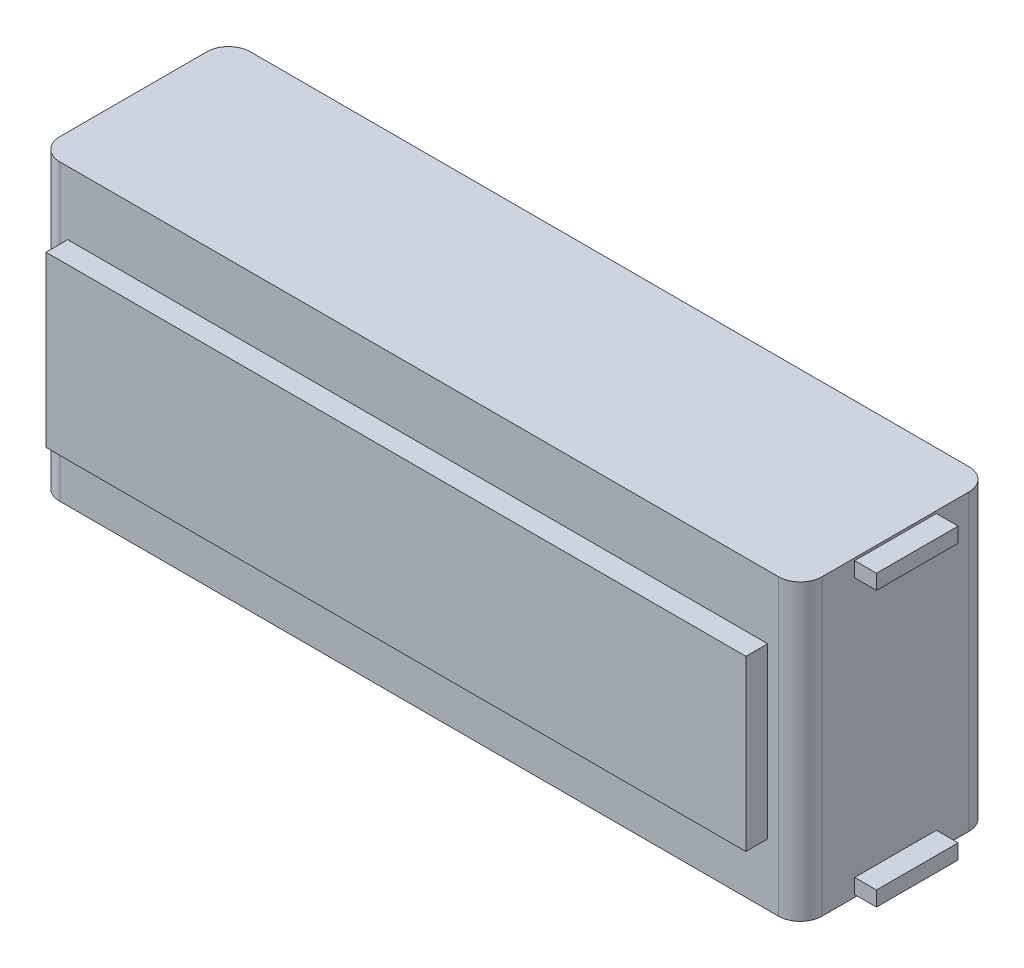
ISO-10303-21;
HEADER;
FILE_DESCRIPTION(('STEP AP214'),'2;1');
FILE_NAME('part.step','',(''),(''),'','','');
FILE_SCHEMA(('AUTOMOTIVE_DESIGN { 1 0 10303 214 1 1 1 1 }'));
ENDSEC;
DATA;
#1=APPLICATION_CONTEXT('core data for automotive mechanical design processes');
#2=APPLICATION_PROTOCOL_DEFINITION('international standard','automotive_design',2000,#1);
#3=PRODUCT_CONTEXT('',#1,'mechanical');
#4=PRODUCT('Part','Part','',(#3));
#5=PRODUCT_RELATED_PRODUCT_CATEGORY('part','',(#4));
#6=PRODUCT_DEFINITION_FORMATION('','',#4);
#7=PRODUCT_DEFINITION_CONTEXT('part definition',#1,'design');
#8=PRODUCT_DEFINITION('design','',#6,#7);
#9=PRODUCT_DEFINITION_SHAPE('','',#8);
#10=(LENGTH_UNIT() NAMED_UNIT(*) SI_UNIT(.MILLI.,.METRE.));
#11=(NAMED_UNIT(*) PLANE_ANGLE_UNIT() SI_UNIT($,.RADIAN.));
#12=(NAMED_UNIT(*) SI_UNIT($,.STERADIAN.) SOLID_ANGLE_UNIT());
#13=UNCERTAINTY_MEASURE_WITH_UNIT(LENGTH_MEASURE(1.E-05),#10,'distance_accuracy_value','');
#14=(GEOMETRIC_REPRESENTATION_CONTEXT(3) GLOBAL_UNCERTAINTY_ASSIGNED_CONTEXT((#13)) GLOBAL_UNIT_ASSIGNED_CONTEXT((#10,
#11,#12)) REPRESENTATION_CONTEXT('',''));
#15=CARTESIAN_POINT('',(0.,0.,0.));
#16=DIRECTION('',(0.,0.,1.));
#17=DIRECTION('',(1.,0.,0.));
#18=AXIS2_PLACEMENT_3D('',#15,#16,#17);
#19=CARTESIAN_POINT('',(0.,0.,22.225));
#20=DIRECTION('',(0.,0.,-1.));
#21=DIRECTION('',(-1.,0.,0.));
#22=AXIS2_PLACEMENT_3D('',#19,#20,#21);
#23=PLANE('',#22);
#24=DIRECTION('',(1.,0.,0.));
#25=VECTOR('',#24,1.);
#26=CARTESIAN_POINT('',(-44.45,-17.145,22.225));
#27=LINE('',#26,#25);
#28=CARTESIAN_POINT('',(-41.91,-17.145,22.225));
#29=VERTEX_POINT('',#28);
#30=CARTESIAN_POINT('',(41.91,-17.145,22.225));
#31=VERTEX_POINT('',#30);
#32=EDGE_CURVE('E268',#29,#31,#27,.T.);
#33=ORIENTED_EDGE('',*,*,#32,.T.);
#34=DIRECTION('',(0.,1.,0.));
#35=VECTOR('',#34,1.);
#36=CARTESIAN_POINT('',(41.91,0.,22.225));
#37=LINE('',#36,#35);
#38=CARTESIAN_POINT('',(41.91,17.145,22.225));
#39=VERTEX_POINT('',#38);
#40=EDGE_CURVE('E316',#31,#39,#37,.T.);
#41=ORIENTED_EDGE('',*,*,#40,.T.);
#42=DIRECTION('',(-1.,0.,0.));
#43=VECTOR('',#42,1.);
#44=CARTESIAN_POINT('',(-44.45,17.145,22.225));
#45=LINE('',#44,#43);
#46=CARTESIAN_POINT('',(-41.91,17.145,22.225));
#47=VERTEX_POINT('',#46);
#48=EDGE_CURVE('E265',#39,#47,#45,.T.);
#49=ORIENTED_EDGE('',*,*,#48,.T.);
#50=DIRECTION('',(0.,-1.,0.));
#51=VECTOR('',#50,1.);
#52=CARTESIAN_POINT('',(-41.91,0.,22.225));
#53=LINE('',#52,#51);
#54=EDGE_CURVE('E313',#47,#29,#53,.T.);
#55=ORIENTED_EDGE('',*,*,#54,.T.);
#56=EDGE_LOOP('',(#33,#41,#49,#55));
#57=FACE_BOUND('',#56,.T.);
#58=DIRECTION('',(0.,1.,0.));
#59=VECTOR('',#58,1.);
#60=CARTESIAN_POINT('',(40.6524536674624,-9.9630945765341,22.225));
#61=LINE('',#60,#59);
#62=CARTESIAN_POINT('',(40.6524536674624,-9.9630945765341,22.225));
#63=VERTEX_POINT('',#62);
#64=CARTESIAN_POINT('',(40.6524536674624,9.74683090603889,22.225));
#65=VERTEX_POINT('',#64);
#66=EDGE_CURVE('E192',#63,#65,#61,.T.);
#67=ORIENTED_EDGE('',*,*,#66,.F.);
#68=DIRECTION('',(1.,0.,0.));
#69=VECTOR('',#68,1.);
#70=CARTESIAN_POINT('',(40.6524536674624,-9.9630945765341,22.225));
#71=LINE('',#70,#69);
#72=CARTESIAN_POINT('',(-40.9796366165907,-9.96309457653411,22.225));
#73=VERTEX_POINT('',#72);
#74=EDGE_CURVE('E189',#73,#63,#71,.T.);
#75=ORIENTED_EDGE('',*,*,#74,.F.);
#76=DIRECTION('',(0.,-1.,0.));
#77=VECTOR('',#76,1.);
#78=CARTESIAN_POINT('',(-40.9796366165907,-9.96309457653411,22.225));
#79=LINE('',#78,#77);
#80=CARTESIAN_POINT('',(-40.9796366165907,9.74683090603888,22.225));
#81=VERTEX_POINT('',#80);
#82=EDGE_CURVE('E55',#81,#73,#79,.T.);
#83=ORIENTED_EDGE('',*,*,#82,.F.);
#84=DIRECTION('',(-1.,0.,0.));
#85=VECTOR('',#84,1.);
#86=CARTESIAN_POINT('',(40.6524536674624,9.74683090603889,22.225));
#87=LINE('',#86,#85);
#88=EDGE_CURVE('E50',#65,#81,#87,.T.);
#89=ORIENTED_EDGE('',*,*,#88,.F.);
#90=EDGE_LOOP('',(#67,#75,#83,#89));
#91=FACE_BOUND('',#90,.T.);
#92=ADVANCED_FACE('F35',(#57,#91),#23,.F.);
#93=CARTESIAN_POINT('',(44.45,-17.145,22.225));
#94=DIRECTION('',(-1.,0.,0.));
#95=DIRECTION('',(0.,0.,1.));
#96=AXIS2_PLACEMENT_3D('',#93,#94,#95);
#97=PLANE('',#96);
#98=DIRECTION('',(0.,0.,-1.));
#99=VECTOR('',#98,1.);
#100=CARTESIAN_POINT('',(44.45,-15.130074387887,15.8753924397186));
#101=LINE('',#100,#99);
#102=CARTESIAN_POINT('',(44.45,-15.130074387887,15.8753924397186));
#103=VERTEX_POINT('',#102);
#104=CARTESIAN_POINT('',(44.45,-15.130074387887,6.34960756028136));
#105=VERTEX_POINT('',#104);
#106=EDGE_CURVE('E196',#103,#105,#101,.T.);
#107=ORIENTED_EDGE('',*,*,#106,.T.);
#108=DIRECTION('',(0.,-1.,0.));
#109=VECTOR('',#108,1.);
#110=CARTESIAN_POINT('',(44.45,-15.130074387887,6.34960756028136));
#111=LINE('',#110,#109);
#112=CARTESIAN_POINT('',(44.45,-16.8635505817285,6.34960756028136));
#113=VERTEX_POINT('',#112);
#114=EDGE_CURVE('E193',#105,#113,#111,.T.);
#115=ORIENTED_EDGE('',*,*,#114,.T.);
#116=DIRECTION('',(0.,0.,1.));
#117=VECTOR('',#116,1.);
#118=CARTESIAN_POINT('',(44.45,-16.8635505817285,15.8753924397186));
#119=LINE('',#118,#117);
#120=CARTESIAN_POINT('',(44.45,-16.8635505817285,15.8753924397186));
#121=VERTEX_POINT('',#120);
#122=EDGE_CURVE('E206',#113,#121,#119,.T.);
#123=ORIENTED_EDGE('',*,*,#122,.T.);
#124=DIRECTION('',(0.,1.,0.));
#125=VECTOR('',#124,1.);
#126=CARTESIAN_POINT('',(44.45,-15.130074387887,15.8753924397186));
#127=LINE('',#126,#125);
#128=EDGE_CURVE('E218',#121,#103,#127,.T.);
#129=ORIENTED_EDGE('',*,*,#128,.T.);
#130=EDGE_LOOP('',(#107,#115,#123,#129));
#131=FACE_BOUND('',#130,.T.);
#132=DIRECTION('',(0.,0.,-1.));
#133=VECTOR('',#132,1.);
#134=CARTESIAN_POINT('',(44.45,-17.145,22.225));
#135=LINE('',#134,#133);
#136=CARTESIAN_POINT('',(44.45,-17.145,19.685));
#137=VERTEX_POINT('',#136);
#138=CARTESIAN_POINT('',(44.45,-17.145,2.54));
#139=VERTEX_POINT('',#138);
#140=EDGE_CURVE('E272',#137,#139,#135,.T.);
#141=ORIENTED_EDGE('',*,*,#140,.T.);
#142=DIRECTION('',(0.,1.,0.));
#143=VECTOR('',#142,1.);
#144=CARTESIAN_POINT('',(44.45,17.145,2.54));
#145=LINE('',#144,#143);
#146=CARTESIAN_POINT('',(44.45,17.145,2.54));
#147=VERTEX_POINT('',#146);
#148=EDGE_CURVE('E290',#139,#147,#145,.T.);
#149=ORIENTED_EDGE('',*,*,#148,.T.);
#150=DIRECTION('',(0.,0.,-1.));
#151=VECTOR('',#150,1.);
#152=CARTESIAN_POINT('',(44.45,17.145,22.225));
#153=LINE('',#152,#151);
#154=CARTESIAN_POINT('',(44.45,17.145,19.685));
#155=VERTEX_POINT('',#154);
#156=EDGE_CURVE('E285',#155,#147,#153,.T.);
#157=ORIENTED_EDGE('',*,*,#156,.F.);
#158=DIRECTION('',(0.,1.,0.));
#159=VECTOR('',#158,1.);
#160=CARTESIAN_POINT('',(44.45,-17.145,19.685));
#161=LINE('',#160,#159);
#162=EDGE_CURVE('E288',#155,#137,#161,.F.);
#163=ORIENTED_EDGE('',*,*,#162,.T.);
#164=EDGE_LOOP('',(#141,#149,#157,#163));
#165=FACE_BOUND('',#164,.T.);
#166=DIRECTION('',(0.,1.,0.));
#167=VECTOR('',#166,1.);
#168=CARTESIAN_POINT('',(44.45,15.130074387887,6.34960756028136));
#169=LINE('',#168,#167);
#170=CARTESIAN_POINT('',(44.45,15.130074387887,6.34960756028136));
#171=VERTEX_POINT('',#170);
#172=CARTESIAN_POINT('',(44.45,16.8635505817285,6.34960756028136));
#173=VERTEX_POINT('',#172);
#174=EDGE_CURVE('E231',#171,#173,#169,.T.);
#175=ORIENTED_EDGE('',*,*,#174,.F.);
#176=DIRECTION('',(0.,0.,-1.));
#177=VECTOR('',#176,1.);
#178=CARTESIAN_POINT('',(44.45,15.130074387887,15.8753924397186));
#179=LINE('',#178,#177);
#180=CARTESIAN_POINT('',(44.45,15.1300743878871,15.8753924397186));
#181=VERTEX_POINT('',#180);
#182=EDGE_CURVE('E236',#181,#171,#179,.T.);
#183=ORIENTED_EDGE('',*,*,#182,.F.);
#184=DIRECTION('',(0.,-1.,0.));
#185=VECTOR('',#184,1.);
#186=CARTESIAN_POINT('',(44.45,15.130074387887,15.8753924397186));
#187=LINE('',#186,#185);
#188=CARTESIAN_POINT('',(44.45,16.8635505817285,15.8753924397186));
#189=VERTEX_POINT('',#188);
#190=EDGE_CURVE('E248',#189,#181,#187,.T.);
#191=ORIENTED_EDGE('',*,*,#190,.F.);
#192=DIRECTION('',(0.,0.,1.));
#193=VECTOR('',#192,1.);
#194=CARTESIAN_POINT('',(44.45,16.8635505817285,15.8753924397186));
#195=LINE('',#194,#193);
#196=EDGE_CURVE('E245',#173,#189,#195,.T.);
#197=ORIENTED_EDGE('',*,*,#196,.F.);
#198=EDGE_LOOP('',(#175,#183,#191,#197));
#199=FACE_BOUND('',#198,.T.);
#200=ADVANCED_FACE('F343',(#131,#165,#199),#97,.F.);
#201=CARTESIAN_POINT('',(-44.45,17.145,22.225));
#202=DIRECTION('',(0.,-1.,0.));
#203=DIRECTION('',(0.,0.,-1.));
#204=AXIS2_PLACEMENT_3D('',#201,#202,#203);
#205=PLANE('',#204);
#206=ORIENTED_EDGE('',*,*,#156,.T.);
#207=CARTESIAN_POINT('',(41.91,17.145,2.54));
#208=DIRECTION('',(0.,-1.,0.));
#209=DIRECTION('',(0.,0.,-1.));
#210=AXIS2_PLACEMENT_3D('',#207,#208,#209);
#211=CIRCLE('',#210,2.54);
#212=CARTESIAN_POINT('',(41.91,17.145,0.));
#213=VERTEX_POINT('',#212);
#214=EDGE_CURVE('E299',#147,#213,#211,.F.);
#215=ORIENTED_EDGE('',*,*,#214,.T.);
#216=DIRECTION('',(-1.,0.,0.));
#217=VECTOR('',#216,1.);
#218=CARTESIAN_POINT('',(-44.45,17.145,0.));
#219=LINE('',#218,#217);
#220=CARTESIAN_POINT('',(-41.91,17.145,0.));
#221=VERTEX_POINT('',#220);
#222=EDGE_CURVE('E264',#213,#221,#219,.T.);
#223=ORIENTED_EDGE('',*,*,#222,.T.);
#224=CARTESIAN_POINT('',(-41.91,17.145,2.54));
#225=DIRECTION('',(0.,-1.,0.));
#226=DIRECTION('',(0.,0.,-1.));
#227=AXIS2_PLACEMENT_3D('',#224,#225,#226);
#228=CIRCLE('',#227,2.54);
#229=CARTESIAN_POINT('',(-44.45,17.145,2.54));
#230=VERTEX_POINT('',#229);
#231=EDGE_CURVE('E295',#221,#230,#228,.F.);
#232=ORIENTED_EDGE('',*,*,#231,.T.);
#233=DIRECTION('',(0.,0.,-1.));
#234=VECTOR('',#233,1.);
#235=CARTESIAN_POINT('',(-44.45,17.145,22.225));
#236=LINE('',#235,#234);
#237=CARTESIAN_POINT('',(-44.45,17.145,19.685));
#238=VERTEX_POINT('',#237);
#239=EDGE_CURVE('E282',#238,#230,#236,.T.);
#240=ORIENTED_EDGE('',*,*,#239,.F.);
#241=CARTESIAN_POINT('',(-41.91,17.145,19.685));
#242=DIRECTION('',(0.,-1.,0.));
#243=DIRECTION('',(0.,0.,-1.));
#244=AXIS2_PLACEMENT_3D('',#241,#242,#243);
#245=CIRCLE('',#244,2.54);
#246=EDGE_CURVE('E293',#238,#47,#245,.F.);
#247=ORIENTED_EDGE('',*,*,#246,.T.);
#248=ORIENTED_EDGE('',*,*,#48,.F.);
#249=CARTESIAN_POINT('',(41.91,17.145,19.685));
#250=DIRECTION('',(0.,-1.,0.));
#251=DIRECTION('',(0.,0.,-1.));
#252=AXIS2_PLACEMENT_3D('',#249,#250,#251);
#253=CIRCLE('',#252,2.54);
#254=EDGE_CURVE('E297',#39,#155,#253,.F.);
#255=ORIENTED_EDGE('',*,*,#254,.T.);
#256=EDGE_LOOP('',(#206,#215,#223,#232,#240,#247,#248,#255));
#257=FACE_BOUND('',#256,.T.);
#258=ADVANCED_FACE('F327',(#257),#205,.F.);
#259=CARTESIAN_POINT('',(-44.45,-17.145,22.225));
#260=DIRECTION('',(1.,0.,0.));
#261=DIRECTION('',(0.,0.,-1.));
#262=AXIS2_PLACEMENT_3D('',#259,#260,#261);
#263=PLANE('',#262);
#264=ORIENTED_EDGE('',*,*,#239,.T.);
#265=DIRECTION('',(0.,-1.,0.));
#266=VECTOR('',#265,1.);
#267=CARTESIAN_POINT('',(-44.45,-17.145,2.54));
#268=LINE('',#267,#266);
#269=CARTESIAN_POINT('',(-44.45,-17.145,2.54));
#270=VERTEX_POINT('',#269);
#271=EDGE_CURVE('E11',#230,#270,#268,.T.);
#272=ORIENTED_EDGE('',*,*,#271,.T.);
#273=DIRECTION('',(0.,0.,-1.));
#274=VECTOR('',#273,1.);
#275=CARTESIAN_POINT('',(-44.45,-17.145,22.225));
#276=LINE('',#275,#274);
#277=CARTESIAN_POINT('',(-44.45,-17.145,19.685));
#278=VERTEX_POINT('',#277);
#279=EDGE_CURVE('E279',#278,#270,#276,.T.);
#280=ORIENTED_EDGE('',*,*,#279,.F.);
#281=DIRECTION('',(0.,-1.,0.));
#282=VECTOR('',#281,1.);
#283=CARTESIAN_POINT('',(-44.45,-17.145,19.685));
#284=LINE('',#283,#282);
#285=EDGE_CURVE('E43',#278,#238,#284,.F.);
#286=ORIENTED_EDGE('',*,*,#285,.T.);
#287=EDGE_LOOP('',(#264,#272,#280,#286));
#288=FACE_BOUND('',#287,.T.);
#289=ADVANCED_FACE('F322',(#288),#263,.F.);
#290=CARTESIAN_POINT('',(-44.45,-17.145,22.225));
#291=DIRECTION('',(0.,1.,0.));
#292=DIRECTION('',(0.,0.,1.));
#293=AXIS2_PLACEMENT_3D('',#290,#291,#292);
#294=PLANE('',#293);
#295=DIRECTION('',(1.,0.,0.));
#296=VECTOR('',#295,1.);
#297=CARTESIAN_POINT('',(-44.45,-17.145,0.));
#298=LINE('',#297,#296);
#299=CARTESIAN_POINT('',(-41.91,-17.145,0.));
#300=VERTEX_POINT('',#299);
#301=CARTESIAN_POINT('',(41.91,-17.145,0.));
#302=VERTEX_POINT('',#301);
#303=EDGE_CURVE('E269',#300,#302,#298,.T.);
#304=ORIENTED_EDGE('',*,*,#303,.T.);
#305=CARTESIAN_POINT('',(41.91,-17.145,2.54));
#306=DIRECTION('',(0.,1.,0.));
#307=DIRECTION('',(0.,0.,1.));
#308=AXIS2_PLACEMENT_3D('',#305,#306,#307);
#309=CIRCLE('',#308,2.54);
#310=EDGE_CURVE('E311',#302,#139,#309,.F.);
#311=ORIENTED_EDGE('',*,*,#310,.T.);
#312=ORIENTED_EDGE('',*,*,#140,.F.);
#313=CARTESIAN_POINT('',(41.91,-17.145,19.685));
#314=DIRECTION('',(0.,1.,0.));
#315=DIRECTION('',(0.,0.,1.));
#316=AXIS2_PLACEMENT_3D('',#313,#314,#315);
#317=CIRCLE('',#316,2.54);
#318=EDGE_CURVE('E309',#137,#31,#317,.F.);
#319=ORIENTED_EDGE('',*,*,#318,.T.);
#320=ORIENTED_EDGE('',*,*,#32,.F.);
#321=CARTESIAN_POINT('',(-41.91,-17.145,19.685));
#322=DIRECTION('',(0.,1.,0.));
#323=DIRECTION('',(0.,0.,1.));
#324=AXIS2_PLACEMENT_3D('',#321,#322,#323);
#325=CIRCLE('',#324,2.54);
#326=EDGE_CURVE('E305',#29,#278,#325,.F.);
#327=ORIENTED_EDGE('',*,*,#326,.T.);
#328=ORIENTED_EDGE('',*,*,#279,.T.);
#329=CARTESIAN_POINT('',(-41.91,-17.145,2.54));
#330=DIRECTION('',(0.,1.,0.));
#331=DIRECTION('',(0.,0.,1.));
#332=AXIS2_PLACEMENT_3D('',#329,#330,#331);
#333=CIRCLE('',#332,2.54);
#334=EDGE_CURVE('E307',#270,#300,#333,.F.);
#335=ORIENTED_EDGE('',*,*,#334,.T.);
#336=EDGE_LOOP('',(#304,#311,#312,#319,#320,#327,#328,#335));
#337=FACE_BOUND('',#336,.T.);
#338=ADVANCED_FACE('F335',(#337),#294,.F.);
#339=CARTESIAN_POINT('',(0.,0.,0.));
#340=DIRECTION('',(0.,0.,-1.));
#341=DIRECTION('',(-1.,0.,0.));
#342=AXIS2_PLACEMENT_3D('',#339,#340,#341);
#343=PLANE('',#342);
#344=ORIENTED_EDGE('',*,*,#222,.F.);
#345=DIRECTION('',(0.,1.,0.));
#346=VECTOR('',#345,1.);
#347=CARTESIAN_POINT('',(41.91,-17.145,0.));
#348=LINE('',#347,#346);
#349=EDGE_CURVE('E303',#213,#302,#348,.F.);
#350=ORIENTED_EDGE('',*,*,#349,.T.);
#351=ORIENTED_EDGE('',*,*,#303,.F.);
#352=DIRECTION('',(0.,-1.,0.));
#353=VECTOR('',#352,1.);
#354=CARTESIAN_POINT('',(-41.91,17.145,0.));
#355=LINE('',#354,#353);
#356=EDGE_CURVE('E301',#300,#221,#355,.F.);
#357=ORIENTED_EDGE('',*,*,#356,.T.);
#358=EDGE_LOOP('',(#344,#350,#351,#357));
#359=FACE_BOUND('',#358,.T.);
#360=ADVANCED_FACE('F352',(#359),#343,.T.);
#361=CARTESIAN_POINT('',(41.91,-17.145,2.54));
#362=DIRECTION('',(0.,-1.,0.));
#363=DIRECTION('',(0.,0.,-1.));
#364=AXIS2_PLACEMENT_3D('',#361,#362,#363);
#365=CYLINDRICAL_SURFACE('',#364,2.54);
#366=ORIENTED_EDGE('',*,*,#310,.F.);
#367=ORIENTED_EDGE('',*,*,#349,.F.);
#368=ORIENTED_EDGE('',*,*,#214,.F.);
#369=ORIENTED_EDGE('',*,*,#148,.F.);
#370=EDGE_LOOP('',(#366,#367,#368,#369));
#371=FACE_BOUND('',#370,.T.);
#372=ADVANCED_FACE('F348',(#371),#365,.T.);
#373=CARTESIAN_POINT('',(41.91,0.,19.685));
#374=DIRECTION('',(0.,1.,0.));
#375=DIRECTION('',(0.,0.,1.));
#376=AXIS2_PLACEMENT_3D('',#373,#374,#375);
#377=CYLINDRICAL_SURFACE('',#376,2.54);
#378=ORIENTED_EDGE('',*,*,#318,.F.);
#379=ORIENTED_EDGE('',*,*,#162,.F.);
#380=ORIENTED_EDGE('',*,*,#254,.F.);
#381=ORIENTED_EDGE('',*,*,#40,.F.);
#382=EDGE_LOOP('',(#378,#379,#380,#381));
#383=FACE_BOUND('',#382,.T.);
#384=ADVANCED_FACE('F340',(#383),#377,.T.);
#385=CARTESIAN_POINT('',(-41.91,-17.145,2.54));
#386=DIRECTION('',(0.,1.,0.));
#387=DIRECTION('',(0.,0.,1.));
#388=AXIS2_PLACEMENT_3D('',#385,#386,#387);
#389=CYLINDRICAL_SURFACE('',#388,2.54);
#390=ORIENTED_EDGE('',*,*,#231,.F.);
#391=ORIENTED_EDGE('',*,*,#356,.F.);
#392=ORIENTED_EDGE('',*,*,#334,.F.);
#393=ORIENTED_EDGE('',*,*,#271,.F.);
#394=EDGE_LOOP('',(#390,#391,#392,#393));
#395=FACE_BOUND('',#394,.T.);
#396=ADVANCED_FACE('F356',(#395),#389,.T.);
#397=CARTESIAN_POINT('',(-41.91,0.,19.685));
#398=DIRECTION('',(0.,-1.,0.));
#399=DIRECTION('',(0.,0.,-1.));
#400=AXIS2_PLACEMENT_3D('',#397,#398,#399);
#401=CYLINDRICAL_SURFACE('',#400,2.54);
#402=ORIENTED_EDGE('',*,*,#246,.F.);
#403=ORIENTED_EDGE('',*,*,#285,.F.);
#404=ORIENTED_EDGE('',*,*,#326,.F.);
#405=ORIENTED_EDGE('',*,*,#54,.F.);
#406=EDGE_LOOP('',(#402,#403,#404,#405));
#407=FACE_BOUND('',#406,.T.);
#408=ADVANCED_FACE('F37',(#407),#401,.T.);
#409=CARTESIAN_POINT('',(46.99,15.130074387887,6.34960756028136));
#410=DIRECTION('',(0.,0.,1.));
#411=DIRECTION('',(1.,0.,0.));
#412=AXIS2_PLACEMENT_3D('',#409,#410,#411);
#413=PLANE('',#412);
#414=ORIENTED_EDGE('',*,*,#174,.T.);
#415=DIRECTION('',(-1.,0.,0.));
#416=VECTOR('',#415,1.);
#417=CARTESIAN_POINT('',(46.99,16.8635505817285,6.34960756028136));
#418=LINE('',#417,#416);
#419=CARTESIAN_POINT('',(46.99,16.8635505817285,6.34960756028136));
#420=VERTEX_POINT('',#419);
#421=EDGE_CURVE('E261',#420,#173,#418,.T.);
#422=ORIENTED_EDGE('',*,*,#421,.F.);
#423=DIRECTION('',(0.,1.,0.));
#424=VECTOR('',#423,1.);
#425=CARTESIAN_POINT('',(46.99,15.130074387887,6.34960756028136));
#426=LINE('',#425,#424);
#427=CARTESIAN_POINT('',(46.99,15.130074387887,6.34960756028136));
#428=VERTEX_POINT('',#427);
#429=EDGE_CURVE('E232',#428,#420,#426,.T.);
#430=ORIENTED_EDGE('',*,*,#429,.F.);
#431=DIRECTION('',(-1.,0.,0.));
#432=VECTOR('',#431,1.);
#433=CARTESIAN_POINT('',(46.99,15.130074387887,6.34960756028136));
#434=LINE('',#433,#432);
#435=EDGE_CURVE('E242',#428,#171,#434,.T.);
#436=ORIENTED_EDGE('',*,*,#435,.T.);
#437=EDGE_LOOP('',(#414,#422,#430,#436));
#438=FACE_BOUND('',#437,.T.);
#439=ADVANCED_FACE('F362',(#438),#413,.F.);
#440=CARTESIAN_POINT('',(46.99,16.8635505817285,15.8753924397186));
#441=DIRECTION('',(0.,-1.,0.));
#442=DIRECTION('',(0.,0.,-1.));
#443=AXIS2_PLACEMENT_3D('',#440,#441,#442);
#444=PLANE('',#443);
#445=ORIENTED_EDGE('',*,*,#196,.T.);
#446=DIRECTION('',(-1.,0.,0.));
#447=VECTOR('',#446,1.);
#448=CARTESIAN_POINT('',(46.99,16.8635505817285,15.8753924397186));
#449=LINE('',#448,#447);
#450=CARTESIAN_POINT('',(46.99,16.8635505817285,15.8753924397186));
#451=VERTEX_POINT('',#450);
#452=EDGE_CURVE('E258',#451,#189,#449,.T.);
#453=ORIENTED_EDGE('',*,*,#452,.F.);
#454=DIRECTION('',(0.,0.,1.));
#455=VECTOR('',#454,1.);
#456=CARTESIAN_POINT('',(46.99,16.8635505817285,15.8753924397186));
#457=LINE('',#456,#455);
#458=EDGE_CURVE('E235',#420,#451,#457,.T.);
#459=ORIENTED_EDGE('',*,*,#458,.F.);
#460=ORIENTED_EDGE('',*,*,#421,.T.);
#461=EDGE_LOOP('',(#445,#453,#459,#460));
#462=FACE_BOUND('',#461,.T.);
#463=ADVANCED_FACE('F413',(#462),#444,.F.);
#464=CARTESIAN_POINT('',(46.99,15.130074387887,15.8753924397186));
#465=DIRECTION('',(0.,0.,-1.));
#466=DIRECTION('',(-1.,0.,0.));
#467=AXIS2_PLACEMENT_3D('',#464,#465,#466);
#468=PLANE('',#467);
#469=ORIENTED_EDGE('',*,*,#190,.T.);
#470=DIRECTION('',(-1.,0.,0.));
#471=VECTOR('',#470,1.);
#472=CARTESIAN_POINT('',(46.99,15.130074387887,15.8753924397186));
#473=LINE('',#472,#471);
#474=CARTESIAN_POINT('',(46.99,15.130074387887,15.8753924397186));
#475=VERTEX_POINT('',#474);
#476=EDGE_CURVE('E255',#475,#181,#473,.T.);
#477=ORIENTED_EDGE('',*,*,#476,.F.);
#478=DIRECTION('',(0.,-1.,0.));
#479=VECTOR('',#478,1.);
#480=CARTESIAN_POINT('',(46.99,15.130074387887,15.8753924397186));
#481=LINE('',#480,#479);
#482=EDGE_CURVE('E238',#451,#475,#481,.T.);
#483=ORIENTED_EDGE('',*,*,#482,.F.);
#484=ORIENTED_EDGE('',*,*,#452,.T.);
#485=EDGE_LOOP('',(#469,#477,#483,#484));
#486=FACE_BOUND('',#485,.T.);
#487=ADVANCED_FACE('F422',(#486),#468,.F.);
#488=CARTESIAN_POINT('',(46.99,15.130074387887,15.8753924397186));
#489=DIRECTION('',(0.,1.,0.));
#490=DIRECTION('',(0.,0.,1.));
#491=AXIS2_PLACEMENT_3D('',#488,#489,#490);
#492=PLANE('',#491);
#493=ORIENTED_EDGE('',*,*,#182,.T.);
#494=ORIENTED_EDGE('',*,*,#435,.F.);
#495=DIRECTION('',(0.,0.,-1.));
#496=VECTOR('',#495,1.);
#497=CARTESIAN_POINT('',(46.99,15.130074387887,15.8753924397186));
#498=LINE('',#497,#496);
#499=EDGE_CURVE('E240',#475,#428,#498,.T.);
#500=ORIENTED_EDGE('',*,*,#499,.F.);
#501=ORIENTED_EDGE('',*,*,#476,.T.);
#502=EDGE_LOOP('',(#493,#494,#500,#501));
#503=FACE_BOUND('',#502,.T.);
#504=ADVANCED_FACE('F431',(#503),#492,.F.);
#505=CARTESIAN_POINT('',(46.99,0.,0.));
#506=DIRECTION('',(-1.,0.,0.));
#507=DIRECTION('',(0.,0.,1.));
#508=AXIS2_PLACEMENT_3D('',#505,#506,#507);
#509=PLANE('',#508);
#510=ORIENTED_EDGE('',*,*,#429,.T.);
#511=ORIENTED_EDGE('',*,*,#458,.T.);
#512=ORIENTED_EDGE('',*,*,#482,.T.);
#513=ORIENTED_EDGE('',*,*,#499,.T.);
#514=EDGE_LOOP('',(#510,#511,#512,#513));
#515=FACE_BOUND('',#514,.T.);
#516=ADVANCED_FACE('F441',(#515),#509,.F.);
#517=CARTESIAN_POINT('',(46.99,-15.130074387887,6.34960756028136));
#518=DIRECTION('',(0.,0.,-1.));
#519=DIRECTION('',(-1.,0.,0.));
#520=AXIS2_PLACEMENT_3D('',#517,#518,#519);
#521=PLANE('',#520);
#522=ORIENTED_EDGE('',*,*,#114,.F.);
#523=DIRECTION('',(-1.,0.,0.));
#524=VECTOR('',#523,1.);
#525=CARTESIAN_POINT('',(46.99,-15.130074387887,6.34960756028136));
#526=LINE('',#525,#524);
#527=CARTESIAN_POINT('',(46.99,-15.130074387887,6.34960756028136));
#528=VERTEX_POINT('',#527);
#529=EDGE_CURVE('E229',#528,#105,#526,.T.);
#530=ORIENTED_EDGE('',*,*,#529,.F.);
#531=DIRECTION('',(0.,-1.,0.));
#532=VECTOR('',#531,1.);
#533=CARTESIAN_POINT('',(46.99,-15.130074387887,6.34960756028136));
#534=LINE('',#533,#532);
#535=CARTESIAN_POINT('',(46.99,-16.8635505817285,6.34960756028136));
#536=VERTEX_POINT('',#535);
#537=EDGE_CURVE('E202',#528,#536,#534,.T.);
#538=ORIENTED_EDGE('',*,*,#537,.T.);
#539=DIRECTION('',(-1.,0.,0.));
#540=VECTOR('',#539,1.);
#541=CARTESIAN_POINT('',(46.99,-16.8635505817285,6.34960756028136));
#542=LINE('',#541,#540);
#543=EDGE_CURVE('E214',#536,#113,#542,.T.);
#544=ORIENTED_EDGE('',*,*,#543,.T.);
#545=EDGE_LOOP('',(#522,#530,#538,#544));
#546=FACE_BOUND('',#545,.T.);
#547=ADVANCED_FACE('F451',(#546),#521,.T.);
#548=CARTESIAN_POINT('',(46.99,-15.130074387887,15.8753924397186));
#549=DIRECTION('',(0.,1.,0.));
#550=DIRECTION('',(0.,0.,1.));
#551=AXIS2_PLACEMENT_3D('',#548,#549,#550);
#552=PLANE('',#551);
#553=ORIENTED_EDGE('',*,*,#106,.F.);
#554=DIRECTION('',(-1.,0.,0.));
#555=VECTOR('',#554,1.);
#556=CARTESIAN_POINT('',(46.99,-15.130074387887,15.8753924397186));
#557=LINE('',#556,#555);
#558=CARTESIAN_POINT('',(46.99,-15.130074387887,15.8753924397186));
#559=VERTEX_POINT('',#558);
#560=EDGE_CURVE('E227',#559,#103,#557,.T.);
#561=ORIENTED_EDGE('',*,*,#560,.F.);
#562=DIRECTION('',(0.,0.,-1.));
#563=VECTOR('',#562,1.);
#564=CARTESIAN_POINT('',(46.99,-15.130074387887,15.8753924397186));
#565=LINE('',#564,#563);
#566=EDGE_CURVE('E205',#559,#528,#565,.T.);
#567=ORIENTED_EDGE('',*,*,#566,.T.);
#568=ORIENTED_EDGE('',*,*,#529,.T.);
#569=EDGE_LOOP('',(#553,#561,#567,#568));
#570=FACE_BOUND('',#569,.T.);
#571=ADVANCED_FACE('F466',(#570),#552,.T.);
#572=CARTESIAN_POINT('',(46.99,-15.130074387887,15.8753924397186));
#573=DIRECTION('',(0.,0.,1.));
#574=DIRECTION('',(1.,0.,0.));
#575=AXIS2_PLACEMENT_3D('',#572,#573,#574);
#576=PLANE('',#575);
#577=ORIENTED_EDGE('',*,*,#128,.F.);
#578=DIRECTION('',(-1.,0.,0.));
#579=VECTOR('',#578,1.);
#580=CARTESIAN_POINT('',(46.99,-16.8635505817285,15.8753924397186));
#581=LINE('',#580,#579);
#582=CARTESIAN_POINT('',(46.99,-16.8635505817285,15.8753924397186));
#583=VERTEX_POINT('',#582);
#584=EDGE_CURVE('E224',#583,#121,#581,.T.);
#585=ORIENTED_EDGE('',*,*,#584,.F.);
#586=DIRECTION('',(0.,1.,0.));
#587=VECTOR('',#586,1.);
#588=CARTESIAN_POINT('',(46.99,-15.130074387887,15.8753924397186));
#589=LINE('',#588,#587);
#590=EDGE_CURVE('E209',#583,#559,#589,.T.);
#591=ORIENTED_EDGE('',*,*,#590,.T.);
#592=ORIENTED_EDGE('',*,*,#560,.T.);
#593=EDGE_LOOP('',(#577,#585,#591,#592));
#594=FACE_BOUND('',#593,.T.);
#595=ADVANCED_FACE('F476',(#594),#576,.T.);
#596=CARTESIAN_POINT('',(46.99,-16.8635505817285,15.8753924397186));
#597=DIRECTION('',(0.,-1.,0.));
#598=DIRECTION('',(0.,0.,-1.));
#599=AXIS2_PLACEMENT_3D('',#596,#597,#598);
#600=PLANE('',#599);
#601=ORIENTED_EDGE('',*,*,#122,.F.);
#602=ORIENTED_EDGE('',*,*,#543,.F.);
#603=DIRECTION('',(0.,0.,1.));
#604=VECTOR('',#603,1.);
#605=CARTESIAN_POINT('',(46.99,-16.8635505817285,15.8753924397186));
#606=LINE('',#605,#604);
#607=EDGE_CURVE('E212',#536,#583,#606,.T.);
#608=ORIENTED_EDGE('',*,*,#607,.T.);
#609=ORIENTED_EDGE('',*,*,#584,.T.);
#610=EDGE_LOOP('',(#601,#602,#608,#609));
#611=FACE_BOUND('',#610,.T.);
#612=ADVANCED_FACE('F486',(#611),#600,.T.);
#613=CARTESIAN_POINT('',(46.99,0.,0.));
#614=DIRECTION('',(-1.,0.,0.));
#615=DIRECTION('',(0.,0.,1.));
#616=AXIS2_PLACEMENT_3D('',#613,#614,#615);
#617=PLANE('',#616);
#618=ORIENTED_EDGE('',*,*,#537,.F.);
#619=ORIENTED_EDGE('',*,*,#566,.F.);
#620=ORIENTED_EDGE('',*,*,#590,.F.);
#621=ORIENTED_EDGE('',*,*,#607,.F.);
#622=EDGE_LOOP('',(#618,#619,#620,#621));
#623=FACE_BOUND('',#622,.T.);
#624=ADVANCED_FACE('F495',(#623),#617,.F.);
#625=CARTESIAN_POINT('',(40.6524536674624,-9.9630945765341,24.765));
#626=DIRECTION('',(-1.,0.,0.));
#627=DIRECTION('',(0.,0.,1.));
#628=AXIS2_PLACEMENT_3D('',#625,#626,#627);
#629=PLANE('',#628);
#630=ORIENTED_EDGE('',*,*,#66,.T.);
#631=DIRECTION('',(0.,0.,-1.));
#632=VECTOR('',#631,1.);
#633=CARTESIAN_POINT('',(40.6524536674624,9.74683090603889,24.765));
#634=LINE('',#633,#632);
#635=CARTESIAN_POINT('',(40.6524536674624,9.74683090603889,24.765));
#636=VERTEX_POINT('',#635);
#637=EDGE_CURVE('E173',#636,#65,#634,.T.);
#638=ORIENTED_EDGE('',*,*,#637,.F.);
#639=DIRECTION('',(0.,1.,0.));
#640=VECTOR('',#639,1.);
#641=CARTESIAN_POINT('',(40.6524536674624,-9.9630945765341,24.765));
#642=LINE('',#641,#640);
#643=CARTESIAN_POINT('',(40.6524536674624,-9.9630945765341,24.765));
#644=VERTEX_POINT('',#643);
#645=EDGE_CURVE('E180',#644,#636,#642,.T.);
#646=ORIENTED_EDGE('',*,*,#645,.F.);
#647=DIRECTION('',(0.,0.,-1.));
#648=VECTOR('',#647,1.);
#649=CARTESIAN_POINT('',(40.6524536674624,-9.9630945765341,24.765));
#650=LINE('',#649,#648);
#651=EDGE_CURVE('E558',#644,#63,#650,.T.);
#652=ORIENTED_EDGE('',*,*,#651,.T.);
#653=EDGE_LOOP('',(#630,#638,#646,#652));
#654=FACE_BOUND('',#653,.T.);
#655=ADVANCED_FACE('F191',(#654),#629,.F.);
#656=CARTESIAN_POINT('',(40.6524536674624,9.74683090603889,24.765));
#657=DIRECTION('',(0.,-1.,0.));
#658=DIRECTION('',(1.,0.,0.));
#659=AXIS2_PLACEMENT_3D('',#656,#657,#658);
#660=PLANE('',#659);
#661=ORIENTED_EDGE('',*,*,#88,.T.);
#662=DIRECTION('',(0.,0.,-1.));
#663=VECTOR('',#662,1.);
#664=CARTESIAN_POINT('',(-40.9796366165907,9.74683090603888,24.765));
#665=LINE('',#664,#663);
#666=CARTESIAN_POINT('',(-40.9796366165907,9.74683090603888,24.765));
#667=VERTEX_POINT('',#666);
#668=EDGE_CURVE('E176',#667,#81,#665,.T.);
#669=ORIENTED_EDGE('',*,*,#668,.F.);
#670=DIRECTION('',(-1.,0.,0.));
#671=VECTOR('',#670,1.);
#672=CARTESIAN_POINT('',(40.6524536674624,9.74683090603889,24.765));
#673=LINE('',#672,#671);
#674=EDGE_CURVE('E169',#636,#667,#673,.T.);
#675=ORIENTED_EDGE('',*,*,#674,.F.);
#676=ORIENTED_EDGE('',*,*,#637,.T.);
#677=EDGE_LOOP('',(#661,#669,#675,#676));
#678=FACE_BOUND('',#677,.T.);
#679=ADVANCED_FACE('F171',(#678),#660,.F.);
#680=CARTESIAN_POINT('',(-40.9796366165907,-9.96309457653411,24.765));
#681=DIRECTION('',(1.,0.,0.));
#682=DIRECTION('',(0.,0.,-1.));
#683=AXIS2_PLACEMENT_3D('',#680,#681,#682);
#684=PLANE('',#683);
#685=ORIENTED_EDGE('',*,*,#82,.T.);
#686=DIRECTION('',(0.,0.,-1.));
#687=VECTOR('',#686,1.);
#688=CARTESIAN_POINT('',(-40.9796366165907,-9.96309457653411,24.765));
#689=LINE('',#688,#687);
#690=CARTESIAN_POINT('',(-40.9796366165907,-9.96309457653411,24.765));
#691=VERTEX_POINT('',#690);
#692=EDGE_CURVE('E198',#691,#73,#689,.T.);
#693=ORIENTED_EDGE('',*,*,#692,.F.);
#694=DIRECTION('',(0.,-1.,0.));
#695=VECTOR('',#694,1.);
#696=CARTESIAN_POINT('',(-40.9796366165907,-9.96309457653411,24.765));
#697=LINE('',#696,#695);
#698=EDGE_CURVE('E179',#667,#691,#697,.T.);
#699=ORIENTED_EDGE('',*,*,#698,.F.);
#700=ORIENTED_EDGE('',*,*,#668,.T.);
#701=EDGE_LOOP('',(#685,#693,#699,#700));
#702=FACE_BOUND('',#701,.T.);
#703=ADVANCED_FACE('F522',(#702),#684,.F.);
#704=CARTESIAN_POINT('',(40.6524536674624,-9.9630945765341,24.765));
#705=DIRECTION('',(0.,1.,0.));
#706=DIRECTION('',(-1.,0.,0.));
#707=AXIS2_PLACEMENT_3D('',#704,#705,#706);
#708=PLANE('',#707);
#709=ORIENTED_EDGE('',*,*,#74,.T.);
#710=ORIENTED_EDGE('',*,*,#651,.F.);
#711=DIRECTION('',(1.,0.,0.));
#712=VECTOR('',#711,1.);
#713=CARTESIAN_POINT('',(40.6524536674624,-9.9630945765341,24.765));
#714=LINE('',#713,#712);
#715=EDGE_CURVE('E185',#691,#644,#714,.T.);
#716=ORIENTED_EDGE('',*,*,#715,.F.);
#717=ORIENTED_EDGE('',*,*,#692,.T.);
#718=EDGE_LOOP('',(#709,#710,#716,#717));
#719=FACE_BOUND('',#718,.T.);
#720=ADVANCED_FACE('F529',(#719),#708,.F.);
#721=CARTESIAN_POINT('',(0.,0.,24.765));
#722=DIRECTION('',(0.,0.,1.));
#723=DIRECTION('',(1.,0.,0.));
#724=AXIS2_PLACEMENT_3D('',#721,#722,#723);
#725=PLANE('',#724);
#726=ORIENTED_EDGE('',*,*,#645,.T.);
#727=ORIENTED_EDGE('',*,*,#674,.T.);
#728=ORIENTED_EDGE('',*,*,#698,.T.);
#729=ORIENTED_EDGE('',*,*,#715,.T.);
#730=EDGE_LOOP('',(#726,#727,#728,#729));
#731=FACE_BOUND('',#730,.T.);
#732=ADVANCED_FACE('F183',(#731),#725,.T.);
#733=CLOSED_SHELL('',(#92,#200,#258,#289,#338,#360,#372,#384,#396,#408,#439,#463,#487,#504,#516,
#547,#571,#595,#612,#624,#655,#679,#703,#720,#732));
#734=MANIFOLD_SOLID_BREP('B2',#733);
#735=ADVANCED_BREP_SHAPE_REPRESENTATION('',(#18,#734),#14);
#736=SHAPE_DEFINITION_REPRESENTATION(#9,#735);
ENDSEC;
END-ISO-10303-21;
